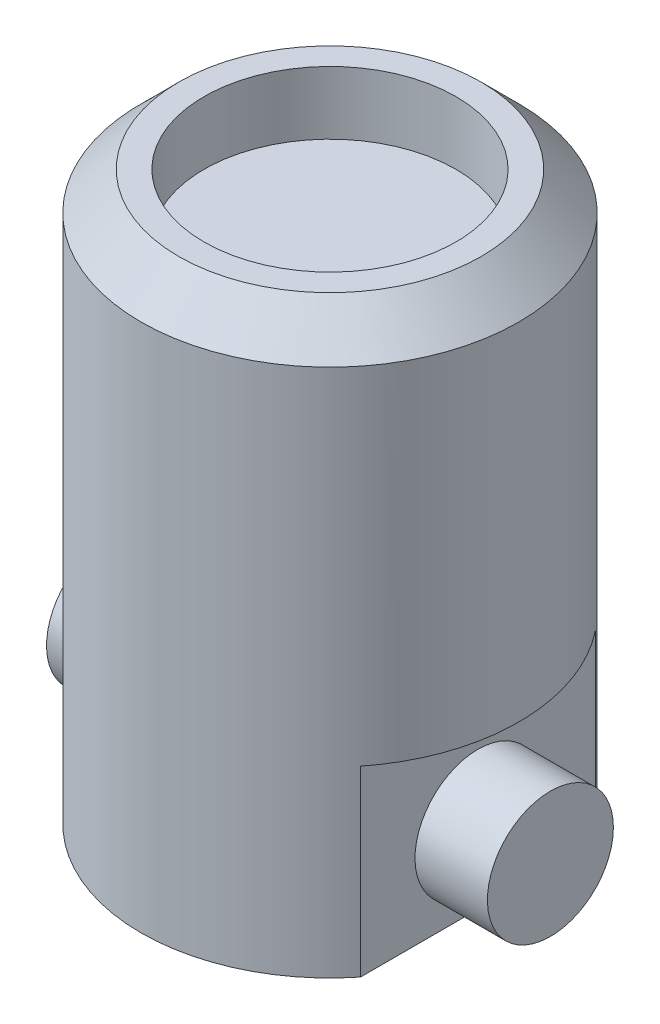
ISO-10303-21;
HEADER;
FILE_DESCRIPTION(('STEP AP214'),'2;1');
FILE_NAME('part.step','',(''),(''),'','','');
FILE_SCHEMA(('AUTOMOTIVE_DESIGN { 1 0 10303 214 1 1 1 1 }'));
ENDSEC;
DATA;
#1=APPLICATION_CONTEXT('core data for automotive mechanical design processes');
#2=APPLICATION_PROTOCOL_DEFINITION('international standard','automotive_design',2000,#1);
#3=PRODUCT_CONTEXT('',#1,'mechanical');
#4=PRODUCT('Part','Part','',(#3));
#5=PRODUCT_RELATED_PRODUCT_CATEGORY('part','',(#4));
#6=PRODUCT_DEFINITION_FORMATION('','',#4);
#7=PRODUCT_DEFINITION_CONTEXT('part definition',#1,'design');
#8=PRODUCT_DEFINITION('design','',#6,#7);
#9=PRODUCT_DEFINITION_SHAPE('','',#8);
#10=(LENGTH_UNIT() NAMED_UNIT(*) SI_UNIT(.MILLI.,.METRE.));
#11=(NAMED_UNIT(*) PLANE_ANGLE_UNIT() SI_UNIT($,.RADIAN.));
#12=(NAMED_UNIT(*) SI_UNIT($,.STERADIAN.) SOLID_ANGLE_UNIT());
#13=UNCERTAINTY_MEASURE_WITH_UNIT(LENGTH_MEASURE(1.E-05),#10,'distance_accuracy_value','');
#14=(GEOMETRIC_REPRESENTATION_CONTEXT(3) GLOBAL_UNCERTAINTY_ASSIGNED_CONTEXT((#13)) GLOBAL_UNIT_ASSIGNED_CONTEXT((#10,
#11,#12)) REPRESENTATION_CONTEXT('',''));
#15=CARTESIAN_POINT('',(0.,0.,0.));
#16=DIRECTION('',(0.,0.,1.));
#17=DIRECTION('',(1.,0.,0.));
#18=AXIS2_PLACEMENT_3D('',#15,#16,#17);
#19=CARTESIAN_POINT('',(0.,90.,0.));
#20=DIRECTION('',(0.,-1.,0.));
#21=DIRECTION('',(0.,0.,-1.));
#22=AXIS2_PLACEMENT_3D('',#19,#20,#21);
#23=CYLINDRICAL_SURFACE('',#22,30.);
#24=CARTESIAN_POINT('',(0.,84.0000000000001,0.));
#25=DIRECTION('',(0.,1.,0.));
#26=DIRECTION('',(0.,0.,1.));
#27=AXIS2_PLACEMENT_3D('',#24,#25,#26);
#28=CIRCLE('',#27,30.);
#29=CARTESIAN_POINT('',(0.,84.0000000000001,30.));
#30=VERTEX_POINT('',#29);
#31=EDGE_CURVE('E11',#30,#30,#28,.F.);
#32=ORIENTED_EDGE('',*,*,#31,.T.);
#33=EDGE_LOOP('',(#32));
#34=FACE_BOUND('',#33,.T.);
#35=DIRECTION('',(0.,-1.,0.));
#36=VECTOR('',#35,1.);
#37=CARTESIAN_POINT('',(23.5,90.,18.6480561989715));
#38=LINE('',#37,#36);
#39=CARTESIAN_POINT('',(23.5,29.,18.6480561989715));
#40=VERTEX_POINT('',#39);
#41=CARTESIAN_POINT('',(23.5,0.,18.6480561989715));
#42=VERTEX_POINT('',#41);
#43=EDGE_CURVE('E84',#40,#42,#38,.T.);
#44=ORIENTED_EDGE('',*,*,#43,.F.);
#45=CARTESIAN_POINT('',(0.,29.,0.));
#46=DIRECTION('',(0.,-1.,0.));
#47=DIRECTION('',(0.,0.,-1.));
#48=AXIS2_PLACEMENT_3D('',#45,#46,#47);
#49=CIRCLE('',#48,30.);
#50=CARTESIAN_POINT('',(23.5,29.,-18.6480561989715));
#51=VERTEX_POINT('',#50);
#52=EDGE_CURVE('E58',#51,#40,#49,.T.);
#53=ORIENTED_EDGE('',*,*,#52,.F.);
#54=DIRECTION('',(0.,-1.,0.));
#55=VECTOR('',#54,1.);
#56=CARTESIAN_POINT('',(23.5,90.,-18.6480561989715));
#57=LINE('',#56,#55);
#58=CARTESIAN_POINT('',(23.5,0.,-18.6480561989715));
#59=VERTEX_POINT('',#58);
#60=EDGE_CURVE('E65',#59,#51,#57,.F.);
#61=ORIENTED_EDGE('',*,*,#60,.F.);
#62=CARTESIAN_POINT('',(0.,0.,0.));
#63=DIRECTION('',(0.,1.,0.));
#64=DIRECTION('',(0.,0.,1.));
#65=AXIS2_PLACEMENT_3D('',#62,#63,#64);
#66=CIRCLE('',#65,30.);
#67=CARTESIAN_POINT('',(-23.5,0.,-18.6480561989715));
#68=VERTEX_POINT('',#67);
#69=EDGE_CURVE('E117',#59,#68,#66,.T.);
#70=ORIENTED_EDGE('',*,*,#69,.T.);
#71=DIRECTION('',(0.,-1.,0.));
#72=VECTOR('',#71,1.);
#73=CARTESIAN_POINT('',(-23.5,90.,-18.6480561989715));
#74=LINE('',#73,#72);
#75=CARTESIAN_POINT('',(-23.5,29.,-18.6480561989715));
#76=VERTEX_POINT('',#75);
#77=EDGE_CURVE('E111',#68,#76,#74,.F.);
#78=ORIENTED_EDGE('',*,*,#77,.T.);
#79=CARTESIAN_POINT('',(0.,29.,0.));
#80=DIRECTION('',(0.,1.,0.));
#81=DIRECTION('',(0.,0.,1.));
#82=AXIS2_PLACEMENT_3D('',#79,#80,#81);
#83=CIRCLE('',#82,30.);
#84=CARTESIAN_POINT('',(-23.5,29.,18.6480561989715));
#85=VERTEX_POINT('',#84);
#86=EDGE_CURVE('E108',#76,#85,#83,.T.);
#87=ORIENTED_EDGE('',*,*,#86,.T.);
#88=DIRECTION('',(0.,-1.,0.));
#89=VECTOR('',#88,1.);
#90=CARTESIAN_POINT('',(-23.5,90.,18.6480561989715));
#91=LINE('',#90,#89);
#92=CARTESIAN_POINT('',(-23.5,0.,18.6480561989715));
#93=VERTEX_POINT('',#92);
#94=EDGE_CURVE('E114',#85,#93,#91,.T.);
#95=ORIENTED_EDGE('',*,*,#94,.T.);
#96=EDGE_CURVE('E109',#93,#42,#66,.T.);
#97=ORIENTED_EDGE('',*,*,#96,.T.);
#98=EDGE_LOOP('',(#44,#53,#61,#70,#78,#87,#95,#97));
#99=FACE_BOUND('',#98,.T.);
#100=ADVANCED_FACE('F43',(#34,#99),#23,.T.);
#101=CARTESIAN_POINT('',(0.,0.,0.));
#102=DIRECTION('',(0.,1.,0.));
#103=DIRECTION('',(0.,0.,1.));
#104=AXIS2_PLACEMENT_3D('',#101,#102,#103);
#105=PLANE('',#104);
#106=DIRECTION('',(0.,0.,-1.));
#107=VECTOR('',#106,1.);
#108=CARTESIAN_POINT('',(23.5,0.,192.116460960662));
#109=LINE('',#108,#107);
#110=EDGE_CURVE('E87',#42,#59,#109,.T.);
#111=ORIENTED_EDGE('',*,*,#110,.F.);
#112=ORIENTED_EDGE('',*,*,#96,.F.);
#113=DIRECTION('',(0.,0.,-1.));
#114=VECTOR('',#113,1.);
#115=CARTESIAN_POINT('',(-23.5,0.,192.116460960662));
#116=LINE('',#115,#114);
#117=EDGE_CURVE('E105',#93,#68,#116,.T.);
#118=ORIENTED_EDGE('',*,*,#117,.T.);
#119=ORIENTED_EDGE('',*,*,#69,.F.);
#120=EDGE_LOOP('',(#111,#112,#118,#119));
#121=FACE_BOUND('',#120,.T.);
#122=ADVANCED_FACE('F150',(#121),#105,.F.);
#123=CARTESIAN_POINT('',(0.,90.,0.));
#124=DIRECTION('',(0.,1.,0.));
#125=DIRECTION('',(0.,0.,1.));
#126=AXIS2_PLACEMENT_3D('',#123,#124,#125);
#127=PLANE('',#126);
#128=CARTESIAN_POINT('',(0.,90.,0.));
#129=DIRECTION('',(0.,1.,0.));
#130=DIRECTION('',(0.,0.,1.));
#131=AXIS2_PLACEMENT_3D('',#128,#129,#130);
#132=CIRCLE('',#131,24.0000000000001);
#133=CARTESIAN_POINT('',(0.,90.,24.0000000000001));
#134=VERTEX_POINT('',#133);
#135=EDGE_CURVE('E52',#134,#134,#132,.T.);
#136=ORIENTED_EDGE('',*,*,#135,.T.);
#137=EDGE_LOOP('',(#136));
#138=FACE_BOUND('',#137,.T.);
#139=CARTESIAN_POINT('',(0.,90.,0.));
#140=DIRECTION('',(0.,1.,0.));
#141=DIRECTION('',(0.,0.,1.));
#142=AXIS2_PLACEMENT_3D('',#139,#140,#141);
#143=CIRCLE('',#142,20.);
#144=CARTESIAN_POINT('',(0.,90.,20.));
#145=VERTEX_POINT('',#144);
#146=EDGE_CURVE('E132',#145,#145,#143,.T.);
#147=ORIENTED_EDGE('',*,*,#146,.F.);
#148=EDGE_LOOP('',(#147));
#149=FACE_BOUND('',#148,.T.);
#150=ADVANCED_FACE('F147',(#138,#149),#127,.T.);
#151=CARTESIAN_POINT('',(-30.,29.,192.116460960662));
#152=DIRECTION('',(0.,1.,0.));
#153=DIRECTION('',(0.,0.,1.));
#154=AXIS2_PLACEMENT_3D('',#151,#152,#153);
#155=PLANE('',#154);
#156=ORIENTED_EDGE('',*,*,#86,.F.);
#157=DIRECTION('',(0.,0.,-1.));
#158=VECTOR('',#157,1.);
#159=CARTESIAN_POINT('',(-23.5,29.,192.116460960662));
#160=LINE('',#159,#158);
#161=EDGE_CURVE('E104',#85,#76,#160,.T.);
#162=ORIENTED_EDGE('',*,*,#161,.F.);
#163=EDGE_LOOP('',(#156,#162));
#164=FACE_BOUND('',#163,.T.);
#165=ADVANCED_FACE('F149',(#164),#155,.F.);
#166=CARTESIAN_POINT('',(-23.5,29.,192.116460960662));
#167=DIRECTION('',(1.,0.,0.));
#168=DIRECTION('',(0.,1.,0.));
#169=AXIS2_PLACEMENT_3D('',#166,#167,#168);
#170=PLANE('',#169);
#171=CARTESIAN_POINT('',(-23.5,12.,0.));
#172=DIRECTION('',(1.,0.,0.));
#173=DIRECTION('',(0.,1.,0.));
#174=AXIS2_PLACEMENT_3D('',#171,#172,#173);
#175=CIRCLE('',#174,10.);
#176=CARTESIAN_POINT('',(-23.5,22.,0.));
#177=VERTEX_POINT('',#176);
#178=EDGE_CURVE('E86',#177,#177,#175,.F.);
#179=ORIENTED_EDGE('',*,*,#178,.F.);
#180=EDGE_LOOP('',(#179));
#181=FACE_BOUND('',#180,.T.);
#182=ORIENTED_EDGE('',*,*,#94,.F.);
#183=ORIENTED_EDGE('',*,*,#161,.T.);
#184=ORIENTED_EDGE('',*,*,#77,.F.);
#185=ORIENTED_EDGE('',*,*,#117,.F.);
#186=EDGE_LOOP('',(#182,#183,#184,#185));
#187=FACE_BOUND('',#186,.T.);
#188=ADVANCED_FACE('F157',(#181,#187),#170,.F.);
#189=CARTESIAN_POINT('',(30.,29.,192.116460960662));
#190=DIRECTION('',(0.,-1.,0.));
#191=DIRECTION('',(0.,0.,-1.));
#192=AXIS2_PLACEMENT_3D('',#189,#190,#191);
#193=PLANE('',#192);
#194=DIRECTION('',(0.,0.,-1.));
#195=VECTOR('',#194,1.);
#196=CARTESIAN_POINT('',(23.5,29.,192.116460960662));
#197=LINE('',#196,#195);
#198=EDGE_CURVE('E92',#40,#51,#197,.T.);
#199=ORIENTED_EDGE('',*,*,#198,.T.);
#200=ORIENTED_EDGE('',*,*,#52,.T.);
#201=EDGE_LOOP('',(#199,#200));
#202=FACE_BOUND('',#201,.T.);
#203=ADVANCED_FACE('F94',(#202),#193,.T.);
#204=CARTESIAN_POINT('',(23.5,29.,192.116460960662));
#205=DIRECTION('',(1.,0.,0.));
#206=DIRECTION('',(0.,1.,0.));
#207=AXIS2_PLACEMENT_3D('',#204,#205,#206);
#208=PLANE('',#207);
#209=CARTESIAN_POINT('',(23.5,12.,0.));
#210=DIRECTION('',(1.,0.,0.));
#211=DIRECTION('',(0.,1.,0.));
#212=AXIS2_PLACEMENT_3D('',#209,#210,#211);
#213=CIRCLE('',#212,10.);
#214=CARTESIAN_POINT('',(23.5,22.,0.));
#215=VERTEX_POINT('',#214);
#216=EDGE_CURVE('E95',#215,#215,#213,.F.);
#217=ORIENTED_EDGE('',*,*,#216,.T.);
#218=EDGE_LOOP('',(#217));
#219=FACE_BOUND('',#218,.T.);
#220=ORIENTED_EDGE('',*,*,#198,.F.);
#221=ORIENTED_EDGE('',*,*,#43,.T.);
#222=ORIENTED_EDGE('',*,*,#110,.T.);
#223=ORIENTED_EDGE('',*,*,#60,.T.);
#224=EDGE_LOOP('',(#220,#221,#222,#223));
#225=FACE_BOUND('',#224,.T.);
#226=ADVANCED_FACE('F91',(#219,#225),#208,.T.);
#227=CARTESIAN_POINT('',(35.,12.,0.));
#228=DIRECTION('',(1.,0.,0.));
#229=DIRECTION('',(0.,0.,-1.));
#230=AXIS2_PLACEMENT_3D('',#227,#228,#229);
#231=PLANE('',#230);
#232=CARTESIAN_POINT('',(35.,12.,0.));
#233=DIRECTION('',(1.,0.,0.));
#234=DIRECTION('',(0.,0.,-1.));
#235=AXIS2_PLACEMENT_3D('',#232,#233,#234);
#236=CIRCLE('',#235,10.);
#237=CARTESIAN_POINT('',(35.,12.,-10.));
#238=VERTEX_POINT('',#237);
#239=EDGE_CURVE('E98',#238,#238,#236,.T.);
#240=ORIENTED_EDGE('',*,*,#239,.T.);
#241=EDGE_LOOP('',(#240));
#242=FACE_BOUND('',#241,.T.);
#243=ADVANCED_FACE('F176',(#242),#231,.T.);
#244=CARTESIAN_POINT('',(35.,12.,0.));
#245=DIRECTION('',(-1.,0.,0.));
#246=DIRECTION('',(0.,0.,1.));
#247=AXIS2_PLACEMENT_3D('',#244,#245,#246);
#248=CYLINDRICAL_SURFACE('',#247,10.);
#249=ORIENTED_EDGE('',*,*,#216,.F.);
#250=EDGE_LOOP('',(#249));
#251=FACE_BOUND('',#250,.T.);
#252=ORIENTED_EDGE('',*,*,#239,.F.);
#253=EDGE_LOOP('',(#252));
#254=FACE_BOUND('',#253,.T.);
#255=ADVANCED_FACE('F179',(#251,#254),#248,.T.);
#256=CARTESIAN_POINT('',(-35.,12.,0.));
#257=DIRECTION('',(1.,0.,0.));
#258=DIRECTION('',(0.,0.,-1.));
#259=AXIS2_PLACEMENT_3D('',#256,#257,#258);
#260=CIRCLE('',#259,10.);
#261=CARTESIAN_POINT('',(-35.,12.,-10.));
#262=VERTEX_POINT('',#261);
#263=EDGE_CURVE('E126',#262,#262,#260,.T.);
#264=ORIENTED_EDGE('',*,*,#263,.T.);
#265=EDGE_LOOP('',(#264));
#266=FACE_BOUND('',#265,.T.);
#267=ORIENTED_EDGE('',*,*,#178,.T.);
#268=EDGE_LOOP('',(#267));
#269=FACE_BOUND('',#268,.T.);
#270=ADVANCED_FACE('F183',(#266,#269),#248,.T.);
#271=CARTESIAN_POINT('',(-35.,12.,0.));
#272=DIRECTION('',(1.,0.,0.));
#273=DIRECTION('',(0.,0.,-1.));
#274=AXIS2_PLACEMENT_3D('',#271,#272,#273);
#275=PLANE('',#274);
#276=ORIENTED_EDGE('',*,*,#263,.F.);
#277=EDGE_LOOP('',(#276));
#278=FACE_BOUND('',#277,.T.);
#279=ADVANCED_FACE('F143',(#278),#275,.F.);
#280=CARTESIAN_POINT('',(0.,80.,0.));
#281=DIRECTION('',(0.,1.,0.));
#282=DIRECTION('',(0.,0.,1.));
#283=AXIS2_PLACEMENT_3D('',#280,#281,#282);
#284=CYLINDRICAL_SURFACE('',#283,20.);
#285=CARTESIAN_POINT('',(0.,80.,0.));
#286=DIRECTION('',(0.,1.,0.));
#287=DIRECTION('',(0.,0.,1.));
#288=AXIS2_PLACEMENT_3D('',#285,#286,#287);
#289=CIRCLE('',#288,20.);
#290=CARTESIAN_POINT('',(0.,80.,20.));
#291=VERTEX_POINT('',#290);
#292=EDGE_CURVE('E129',#291,#291,#289,.T.);
#293=ORIENTED_EDGE('',*,*,#292,.F.);
#294=EDGE_LOOP('',(#293));
#295=FACE_BOUND('',#294,.T.);
#296=ORIENTED_EDGE('',*,*,#146,.T.);
#297=EDGE_LOOP('',(#296));
#298=FACE_BOUND('',#297,.T.);
#299=ADVANCED_FACE('F140',(#295,#298),#284,.F.);
#300=CARTESIAN_POINT('',(0.,80.,0.));
#301=DIRECTION('',(0.,1.,0.));
#302=DIRECTION('',(0.,0.,1.));
#303=AXIS2_PLACEMENT_3D('',#300,#301,#302);
#304=PLANE('',#303);
#305=ORIENTED_EDGE('',*,*,#292,.T.);
#306=EDGE_LOOP('',(#305));
#307=FACE_BOUND('',#306,.T.);
#308=ADVANCED_FACE('F138',(#307),#304,.T.);
#309=CARTESIAN_POINT('',(0.,90.,0.));
#310=DIRECTION('',(0.,-1.,0.));
#311=DIRECTION('',(0.,0.,-1.));
#312=AXIS2_PLACEMENT_3D('',#309,#310,#311);
#313=CONICAL_SURFACE('',#312,24.0000000000001,0.785398163397445);
#314=ORIENTED_EDGE('',*,*,#31,.F.);
#315=EDGE_LOOP('',(#314));
#316=FACE_BOUND('',#315,.T.);
#317=ORIENTED_EDGE('',*,*,#135,.F.);
#318=EDGE_LOOP('',(#317));
#319=FACE_BOUND('',#318,.T.);
#320=ADVANCED_FACE('F46',(#316,#319),#313,.T.);
#321=CLOSED_SHELL('',(#100,#122,#150,#165,#188,#203,#226,#243,#255,#270,#279,#299,#308,#320));
#322=MANIFOLD_SOLID_BREP('B2',#321);
#323=ADVANCED_BREP_SHAPE_REPRESENTATION('',(#18,#322),#14);
#324=SHAPE_DEFINITION_REPRESENTATION(#9,#323);
ENDSEC;
END-ISO-10303-21;
